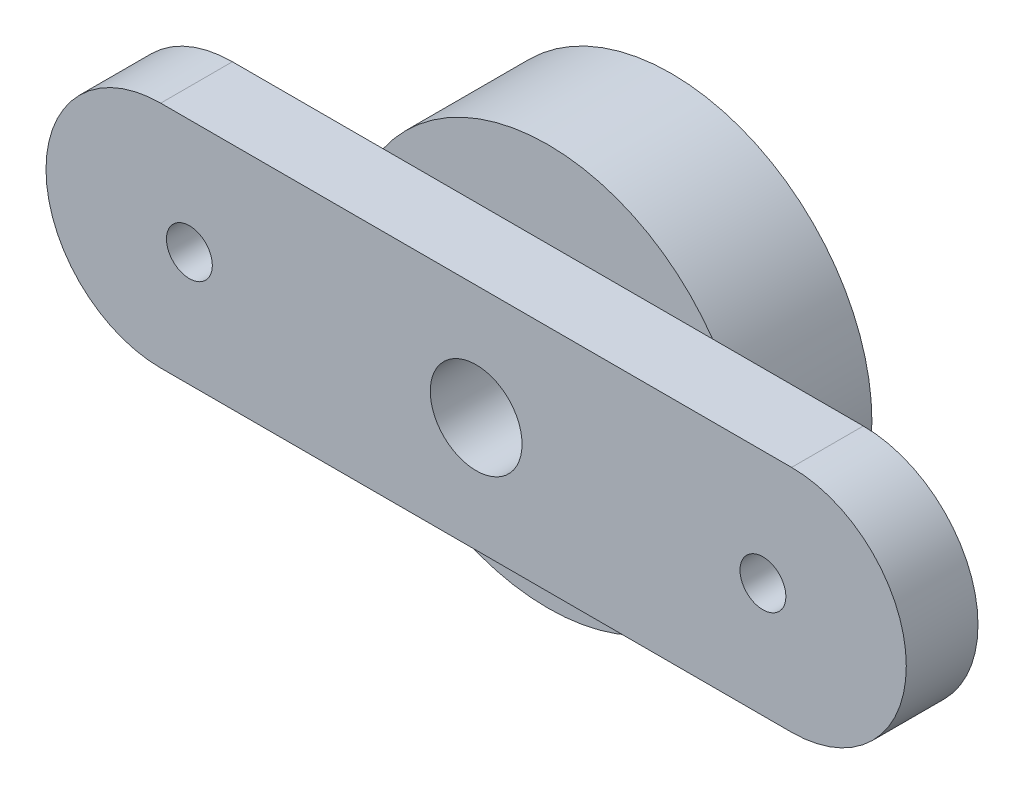
ISO-10303-21;
HEADER;
FILE_DESCRIPTION(('STEP AP214'),'2;1');
FILE_NAME('part.step','',(''),(''),'','','');
FILE_SCHEMA(('AUTOMOTIVE_DESIGN { 1 0 10303 214 1 1 1 1 }'));
ENDSEC;
DATA;
#1=APPLICATION_CONTEXT('core data for automotive mechanical design processes');
#2=APPLICATION_PROTOCOL_DEFINITION('international standard','automotive_design',2000,#1);
#3=PRODUCT_CONTEXT('',#1,'mechanical');
#4=PRODUCT('Part','Part','',(#3));
#5=PRODUCT_RELATED_PRODUCT_CATEGORY('part','',(#4));
#6=PRODUCT_DEFINITION_FORMATION('','',#4);
#7=PRODUCT_DEFINITION_CONTEXT('part definition',#1,'design');
#8=PRODUCT_DEFINITION('design','',#6,#7);
#9=PRODUCT_DEFINITION_SHAPE('','',#8);
#10=(LENGTH_UNIT() NAMED_UNIT(*) SI_UNIT(.MILLI.,.METRE.));
#11=(NAMED_UNIT(*) PLANE_ANGLE_UNIT() SI_UNIT($,.RADIAN.));
#12=(NAMED_UNIT(*) SI_UNIT($,.STERADIAN.) SOLID_ANGLE_UNIT());
#13=UNCERTAINTY_MEASURE_WITH_UNIT(LENGTH_MEASURE(1.E-05),#10,'distance_accuracy_value','');
#14=(GEOMETRIC_REPRESENTATION_CONTEXT(3) GLOBAL_UNCERTAINTY_ASSIGNED_CONTEXT((#13)) GLOBAL_UNIT_ASSIGNED_CONTEXT((#10,
#11,#12)) REPRESENTATION_CONTEXT('',''));
#15=CARTESIAN_POINT('',(0.,0.,0.));
#16=DIRECTION('',(0.,0.,1.));
#17=DIRECTION('',(1.,0.,0.));
#18=AXIS2_PLACEMENT_3D('',#15,#16,#17);
#19=CARTESIAN_POINT('',(0.,0.,6.5));
#20=DIRECTION('',(0.,0.,1.));
#21=DIRECTION('',(1.,0.,0.));
#22=AXIS2_PLACEMENT_3D('',#19,#20,#21);
#23=PLANE('',#22);
#24=DIRECTION('',(-1.,0.,0.));
#25=VECTOR('',#24,1.);
#26=CARTESIAN_POINT('',(-11.,4.,6.5));
#27=LINE('',#26,#25);
#28=CARTESIAN_POINT('',(5.74456264653803,4.,6.5));
#29=VERTEX_POINT('',#28);
#30=CARTESIAN_POINT('',(-5.74456264653803,4.,6.5));
#31=VERTEX_POINT('',#30);
#32=EDGE_CURVE('E11',#29,#31,#27,.T.);
#33=ORIENTED_EDGE('',*,*,#32,.F.);
#34=CARTESIAN_POINT('',(0.,0.,6.5));
#35=DIRECTION('',(0.,0.,1.));
#36=DIRECTION('',(1.,0.,0.));
#37=AXIS2_PLACEMENT_3D('',#34,#35,#36);
#38=CIRCLE('',#37,7.);
#39=EDGE_CURVE('E135',#29,#31,#38,.T.);
#40=ORIENTED_EDGE('',*,*,#39,.T.);
#41=EDGE_LOOP('',(#33,#40));
#42=FACE_BOUND('',#41,.T.);
#43=ADVANCED_FACE('F39',(#42),#23,.T.);
#44=DIRECTION('',(1.,0.,0.));
#45=VECTOR('',#44,1.);
#46=CARTESIAN_POINT('',(11.,-4.,6.5));
#47=LINE('',#46,#45);
#48=CARTESIAN_POINT('',(-5.74456264653803,-4.,6.5));
#49=VERTEX_POINT('',#48);
#50=CARTESIAN_POINT('',(5.74456264653803,-4.,6.5));
#51=VERTEX_POINT('',#50);
#52=EDGE_CURVE('E48',#49,#51,#47,.T.);
#53=ORIENTED_EDGE('',*,*,#52,.F.);
#54=EDGE_CURVE('E137',#49,#51,#38,.T.);
#55=ORIENTED_EDGE('',*,*,#54,.T.);
#56=EDGE_LOOP('',(#53,#55));
#57=FACE_BOUND('',#56,.T.);
#58=ADVANCED_FACE('F151',(#57),#23,.T.);
#59=CARTESIAN_POINT('',(0.,0.,2.2));
#60=DIRECTION('',(0.,0.,1.));
#61=DIRECTION('',(1.,0.,0.));
#62=AXIS2_PLACEMENT_3D('',#59,#60,#61);
#63=PLANE('',#62);
#64=CARTESIAN_POINT('',(0.,0.,2.2));
#65=DIRECTION('',(0.,0.,1.));
#66=DIRECTION('',(1.,0.,0.));
#67=AXIS2_PLACEMENT_3D('',#64,#65,#66);
#68=CIRCLE('',#67,7.);
#69=CARTESIAN_POINT('',(7.,0.,2.2));
#70=VERTEX_POINT('',#69);
#71=EDGE_CURVE('E43',#70,#70,#68,.T.);
#72=ORIENTED_EDGE('',*,*,#71,.F.);
#73=EDGE_LOOP('',(#72));
#74=FACE_BOUND('',#73,.T.);
#75=CARTESIAN_POINT('',(0.,0.,2.2));
#76=DIRECTION('',(0.,0.,1.));
#77=DIRECTION('',(1.,0.,0.));
#78=AXIS2_PLACEMENT_3D('',#75,#76,#77);
#79=CIRCLE('',#78,3.05);
#80=CARTESIAN_POINT('',(-3.05,0.,2.2));
#81=VERTEX_POINT('',#80);
#82=EDGE_CURVE('E124',#81,#81,#79,.T.);
#83=ORIENTED_EDGE('',*,*,#82,.T.);
#84=EDGE_LOOP('',(#83));
#85=FACE_BOUND('',#84,.T.);
#86=ADVANCED_FACE('F148',(#74,#85),#63,.F.);
#87=CARTESIAN_POINT('',(0.,0.,6.5));
#88=DIRECTION('',(0.,0.,-1.));
#89=DIRECTION('',(-1.,0.,0.));
#90=AXIS2_PLACEMENT_3D('',#87,#88,#89);
#91=CYLINDRICAL_SURFACE('',#90,7.);
#92=ORIENTED_EDGE('',*,*,#39,.F.);
#93=EDGE_CURVE('E133',#51,#29,#38,.T.);
#94=ORIENTED_EDGE('',*,*,#93,.F.);
#95=ORIENTED_EDGE('',*,*,#54,.F.);
#96=EDGE_CURVE('E61',#31,#49,#38,.T.);
#97=ORIENTED_EDGE('',*,*,#96,.F.);
#98=EDGE_LOOP('',(#92,#94,#95,#97));
#99=FACE_BOUND('',#98,.T.);
#100=ORIENTED_EDGE('',*,*,#71,.T.);
#101=EDGE_LOOP('',(#100));
#102=FACE_BOUND('',#101,.T.);
#103=ADVANCED_FACE('F41',(#99,#102),#91,.T.);
#104=CARTESIAN_POINT('',(0.,0.,6.5));
#105=DIRECTION('',(0.,0.,-1.));
#106=DIRECTION('',(-1.,0.,0.));
#107=AXIS2_PLACEMENT_3D('',#104,#105,#106);
#108=CYLINDRICAL_SURFACE('',#107,3.05);
#109=CARTESIAN_POINT('',(0.,0.,6.5));
#110=DIRECTION('',(0.,0.,1.));
#111=DIRECTION('',(1.,0.,0.));
#112=AXIS2_PLACEMENT_3D('',#109,#110,#111);
#113=CIRCLE('',#112,3.05);
#114=CARTESIAN_POINT('',(-3.05,0.,6.5));
#115=VERTEX_POINT('',#114);
#116=EDGE_CURVE('E122',#115,#115,#113,.T.);
#117=CARTESIAN_POINT('',(-3.05,0.,6.5));
#118=CARTESIAN_POINT('',(-3.05,0.,6.45520833333333));
#119=CARTESIAN_POINT('',(-3.05,0.,6.41041666666667));
#120=CARTESIAN_POINT('',(-3.05,0.,6.32083333333333));
#121=CARTESIAN_POINT('',(-3.05,0.,6.27604166666667));
#122=CARTESIAN_POINT('',(-3.05,0.,6.18645833333333));
#123=CARTESIAN_POINT('',(-3.05,0.,6.14166666666667));
#124=CARTESIAN_POINT('',(-3.05,0.,6.05208333333333));
#125=CARTESIAN_POINT('',(-3.05,0.,6.00729166666667));
#126=CARTESIAN_POINT('',(-3.05,0.,5.91770833333333));
#127=CARTESIAN_POINT('',(-3.05,0.,5.87291666666667));
#128=CARTESIAN_POINT('',(-3.05,0.,5.78333333333333));
#129=CARTESIAN_POINT('',(-3.05,0.,5.73854166666667));
#130=CARTESIAN_POINT('',(-3.05,0.,5.64895833333333));
#131=CARTESIAN_POINT('',(-3.05,0.,5.60416666666667));
#132=CARTESIAN_POINT('',(-3.05,0.,5.51458333333333));
#133=CARTESIAN_POINT('',(-3.05,0.,5.46979166666667));
#134=CARTESIAN_POINT('',(-3.05,0.,5.38020833333333));
#135=CARTESIAN_POINT('',(-3.05,0.,5.33541666666667));
#136=CARTESIAN_POINT('',(-3.05,0.,5.24583333333333));
#137=CARTESIAN_POINT('',(-3.05,0.,5.20104166666667));
#138=CARTESIAN_POINT('',(-3.05,0.,5.11145833333333));
#139=CARTESIAN_POINT('',(-3.05,0.,5.06666666666667));
#140=CARTESIAN_POINT('',(-3.05,0.,4.97708333333333));
#141=CARTESIAN_POINT('',(-3.05,0.,4.93229166666667));
#142=CARTESIAN_POINT('',(-3.05,0.,4.84270833333333));
#143=CARTESIAN_POINT('',(-3.05,0.,4.79791666666667));
#144=CARTESIAN_POINT('',(-3.05,0.,4.70833333333333));
#145=CARTESIAN_POINT('',(-3.05,0.,4.66354166666667));
#146=CARTESIAN_POINT('',(-3.05,0.,4.57395833333333));
#147=CARTESIAN_POINT('',(-3.05,0.,4.52916666666667));
#148=CARTESIAN_POINT('',(-3.05,0.,4.43958333333333));
#149=CARTESIAN_POINT('',(-3.05,0.,4.39479166666667));
#150=CARTESIAN_POINT('',(-3.05,0.,4.30520833333333));
#151=CARTESIAN_POINT('',(-3.05,0.,4.26041666666667));
#152=CARTESIAN_POINT('',(-3.05,0.,4.17083333333333));
#153=CARTESIAN_POINT('',(-3.05,0.,4.12604166666667));
#154=CARTESIAN_POINT('',(-3.05,0.,4.03645833333333));
#155=CARTESIAN_POINT('',(-3.05,0.,3.99166666666667));
#156=CARTESIAN_POINT('',(-3.05,0.,3.90208333333333));
#157=CARTESIAN_POINT('',(-3.05,0.,3.85729166666667));
#158=CARTESIAN_POINT('',(-3.05,0.,3.76770833333333));
#159=CARTESIAN_POINT('',(-3.05,0.,3.72291666666667));
#160=CARTESIAN_POINT('',(-3.05,0.,3.63333333333333));
#161=CARTESIAN_POINT('',(-3.05,0.,3.58854166666667));
#162=CARTESIAN_POINT('',(-3.05,0.,3.49895833333333));
#163=CARTESIAN_POINT('',(-3.05,0.,3.45416666666667));
#164=CARTESIAN_POINT('',(-3.05,0.,3.36458333333333));
#165=CARTESIAN_POINT('',(-3.05,0.,3.31979166666667));
#166=CARTESIAN_POINT('',(-3.05,0.,3.23020833333333));
#167=CARTESIAN_POINT('',(-3.05,0.,3.18541666666667));
#168=CARTESIAN_POINT('',(-3.05,0.,3.09583333333333));
#169=CARTESIAN_POINT('',(-3.05,0.,3.05104166666667));
#170=CARTESIAN_POINT('',(-3.05,0.,2.96145833333333));
#171=CARTESIAN_POINT('',(-3.05,0.,2.91666666666667));
#172=CARTESIAN_POINT('',(-3.05,0.,2.82708333333333));
#173=CARTESIAN_POINT('',(-3.05,0.,2.78229166666667));
#174=CARTESIAN_POINT('',(-3.05,0.,2.69270833333333));
#175=CARTESIAN_POINT('',(-3.05,0.,2.64791666666667));
#176=CARTESIAN_POINT('',(-3.05,0.,2.55833333333333));
#177=CARTESIAN_POINT('',(-3.05,0.,2.51354166666667));
#178=CARTESIAN_POINT('',(-3.05,0.,2.42395833333333));
#179=CARTESIAN_POINT('',(-3.05,0.,2.37916666666667));
#180=CARTESIAN_POINT('',(-3.05,0.,2.28958333333333));
#181=CARTESIAN_POINT('',(-3.05,0.,2.24479166666667));
#182=CARTESIAN_POINT('',(-3.05,0.,2.2));
#183=B_SPLINE_CURVE_WITH_KNOTS('',3,(#117,#118,#119,#120,#121,#122,#123,#124,#125,#126,#127,
#128,#129,#130,#131,#132,#133,#134,#135,#136,#137,#138,#139,#140,#141,#142,#143,#144,#145,#146,
#147,#148,#149,#150,#151,#152,#153,#154,#155,#156,#157,#158,#159,#160,#161,#162,#163,#164,#165,
#166,#167,#168,#169,#170,#171,#172,#173,#174,#175,#176,#177,#178,#179,#180,#181,#182),
.UNSPECIFIED.,.F.,.F.,(4,2,2,2,2,2,2,2,2,2,2,2,2,2,2,2,2,2,2,2,2,2,2,2,2,2,2,2,2,2,2,2,4),(0.,
0.134375000000001,0.268750000000001,0.403125000000001,0.537500000000001,0.671875000000001,
0.806250000000001,0.940625,1.075,1.209375,1.34375,1.478125,1.6125,1.746875,1.88125,2.015625,
2.15,2.284375,2.41875,2.553125,2.6875,2.821875,2.95625,3.090625,3.225,3.359375,3.49375,3.628125,
3.7625,3.896875,4.03125,4.165625,4.3),.UNSPECIFIED.);
#184=EDGE_CURVE('BSEAM157',#115,#81,#183,.T.);
#185=ORIENTED_EDGE('',*,*,#116,.T.);
#186=ORIENTED_EDGE('',*,*,#82,.F.);
#187=ORIENTED_EDGE('',*,*,#184,.T.);
#188=ORIENTED_EDGE('',*,*,#184,.F.);
#189=EDGE_LOOP('',(#185,#187,#186,#188));
#190=FACE_BOUND('',#189,.T.);
#191=ADVANCED_FACE('F157',(#190),#108,.F.);
#192=CARTESIAN_POINT('',(-11.,0.,6.5));
#193=DIRECTION('',(0.,0.,-1.));
#194=DIRECTION('',(-1.,0.,0.));
#195=AXIS2_PLACEMENT_3D('',#192,#193,#194);
#196=PLANE('',#195);
#197=CARTESIAN_POINT('',(-10.,0.,6.5));
#198=DIRECTION('',(0.,0.,1.));
#199=DIRECTION('',(1.,0.,0.));
#200=AXIS2_PLACEMENT_3D('',#197,#198,#199);
#201=CIRCLE('',#200,0.8);
#202=CARTESIAN_POINT('',(-9.2,0.,6.5));
#203=VERTEX_POINT('',#202);
#204=EDGE_CURVE('E197',#203,#203,#201,.T.);
#205=ORIENTED_EDGE('',*,*,#204,.T.);
#206=EDGE_LOOP('',(#205));
#207=FACE_BOUND('',#206,.T.);
#208=CARTESIAN_POINT('',(-11.,4.,6.5));
#209=VERTEX_POINT('',#208);
#210=EDGE_CURVE('E51',#31,#209,#27,.T.);
#211=ORIENTED_EDGE('',*,*,#210,.F.);
#212=ORIENTED_EDGE('',*,*,#96,.T.);
#213=CARTESIAN_POINT('',(-11.,-4.,6.5));
#214=VERTEX_POINT('',#213);
#215=EDGE_CURVE('E140',#214,#49,#47,.T.);
#216=ORIENTED_EDGE('',*,*,#215,.F.);
#217=CARTESIAN_POINT('',(-11.,0.,6.5));
#218=DIRECTION('',(0.,0.,1.));
#219=DIRECTION('',(-1.,0.,0.));
#220=AXIS2_PLACEMENT_3D('',#217,#218,#219);
#221=CIRCLE('',#220,4.);
#222=EDGE_CURVE('E123',#209,#214,#221,.T.);
#223=ORIENTED_EDGE('',*,*,#222,.F.);
#224=EDGE_LOOP('',(#211,#212,#216,#223));
#225=FACE_BOUND('',#224,.T.);
#226=ADVANCED_FACE('F156',(#207,#225),#196,.T.);
#227=CARTESIAN_POINT('',(0.,0.,6.5));
#228=DIRECTION('',(0.,0.,1.));
#229=DIRECTION('',(1.,0.,0.));
#230=AXIS2_PLACEMENT_3D('',#227,#228,#229);
#231=CIRCLE('',#230,1.6);
#232=CARTESIAN_POINT('',(1.6,0.,6.5));
#233=VERTEX_POINT('',#232);
#234=EDGE_CURVE('E195',#233,#233,#231,.T.);
#235=ORIENTED_EDGE('',*,*,#234,.T.);
#236=EDGE_LOOP('',(#235));
#237=FACE_BOUND('',#236,.T.);
#238=ORIENTED_EDGE('',*,*,#116,.F.);
#239=EDGE_LOOP('',(#238));
#240=FACE_BOUND('',#239,.T.);
#241=ADVANCED_FACE('F164',(#237,#240),#196,.T.);
#242=CARTESIAN_POINT('',(-11.,0.,9.));
#243=DIRECTION('',(0.,0.,-1.));
#244=DIRECTION('',(-1.,0.,0.));
#245=AXIS2_PLACEMENT_3D('',#242,#243,#244);
#246=PLANE('',#245);
#247=CARTESIAN_POINT('',(-11.,0.,9.));
#248=DIRECTION('',(0.,0.,1.));
#249=DIRECTION('',(-1.,0.,0.));
#250=AXIS2_PLACEMENT_3D('',#247,#248,#249);
#251=CIRCLE('',#250,4.);
#252=CARTESIAN_POINT('',(-11.,4.,9.));
#253=VERTEX_POINT('',#252);
#254=CARTESIAN_POINT('',(-11.,-4.,9.));
#255=VERTEX_POINT('',#254);
#256=EDGE_CURVE('E106',#253,#255,#251,.T.);
#257=ORIENTED_EDGE('',*,*,#256,.T.);
#258=DIRECTION('',(1.,0.,0.));
#259=VECTOR('',#258,1.);
#260=CARTESIAN_POINT('',(11.,-4.,9.));
#261=LINE('',#260,#259);
#262=CARTESIAN_POINT('',(11.,-4.,9.));
#263=VERTEX_POINT('',#262);
#264=EDGE_CURVE('E96',#255,#263,#261,.T.);
#265=ORIENTED_EDGE('',*,*,#264,.T.);
#266=CARTESIAN_POINT('',(11.,0.,9.));
#267=DIRECTION('',(0.,0.,1.));
#268=DIRECTION('',(-1.,0.,0.));
#269=AXIS2_PLACEMENT_3D('',#266,#267,#268);
#270=CIRCLE('',#269,4.);
#271=CARTESIAN_POINT('',(11.,4.,9.));
#272=VERTEX_POINT('',#271);
#273=EDGE_CURVE('E110',#263,#272,#270,.T.);
#274=ORIENTED_EDGE('',*,*,#273,.T.);
#275=DIRECTION('',(-1.,0.,0.));
#276=VECTOR('',#275,1.);
#277=CARTESIAN_POINT('',(-11.,4.,9.));
#278=LINE('',#277,#276);
#279=EDGE_CURVE('E114',#272,#253,#278,.T.);
#280=ORIENTED_EDGE('',*,*,#279,.T.);
#281=EDGE_LOOP('',(#257,#265,#274,#280));
#282=FACE_BOUND('',#281,.T.);
#283=CARTESIAN_POINT('',(0.,0.,9.));
#284=DIRECTION('',(0.,0.,1.));
#285=DIRECTION('',(1.,0.,0.));
#286=AXIS2_PLACEMENT_3D('',#283,#284,#285);
#287=CIRCLE('',#286,1.6);
#288=CARTESIAN_POINT('',(1.6,0.,9.));
#289=VERTEX_POINT('',#288);
#290=EDGE_CURVE('E193',#289,#289,#287,.T.);
#291=ORIENTED_EDGE('',*,*,#290,.F.);
#292=EDGE_LOOP('',(#291));
#293=FACE_BOUND('',#292,.T.);
#294=CARTESIAN_POINT('',(-10.,0.,9.));
#295=DIRECTION('',(0.,0.,1.));
#296=DIRECTION('',(1.,0.,0.));
#297=AXIS2_PLACEMENT_3D('',#294,#295,#296);
#298=CIRCLE('',#297,0.8);
#299=CARTESIAN_POINT('',(-9.2,0.,9.));
#300=VERTEX_POINT('',#299);
#301=EDGE_CURVE('E198',#300,#300,#298,.T.);
#302=ORIENTED_EDGE('',*,*,#301,.F.);
#303=EDGE_LOOP('',(#302));
#304=FACE_BOUND('',#303,.T.);
#305=CARTESIAN_POINT('',(10.,0.,9.));
#306=DIRECTION('',(0.,0.,1.));
#307=DIRECTION('',(1.,0.,0.));
#308=AXIS2_PLACEMENT_3D('',#305,#306,#307);
#309=CIRCLE('',#308,0.8);
#310=CARTESIAN_POINT('',(10.8,0.,9.));
#311=VERTEX_POINT('',#310);
#312=EDGE_CURVE('E205',#311,#311,#309,.T.);
#313=ORIENTED_EDGE('',*,*,#312,.F.);
#314=EDGE_LOOP('',(#313));
#315=FACE_BOUND('',#314,.T.);
#316=ADVANCED_FACE('F112',(#282,#293,#304,#315),#246,.F.);
#317=CARTESIAN_POINT('',(11.,-4.,6.5));
#318=VERTEX_POINT('',#317);
#319=EDGE_CURVE('E138',#51,#318,#47,.T.);
#320=ORIENTED_EDGE('',*,*,#319,.F.);
#321=ORIENTED_EDGE('',*,*,#93,.T.);
#322=CARTESIAN_POINT('',(11.,4.,6.5));
#323=VERTEX_POINT('',#322);
#324=EDGE_CURVE('E49',#323,#29,#27,.T.);
#325=ORIENTED_EDGE('',*,*,#324,.F.);
#326=CARTESIAN_POINT('',(11.,0.,6.5));
#327=DIRECTION('',(0.,0.,1.));
#328=DIRECTION('',(-1.,0.,0.));
#329=AXIS2_PLACEMENT_3D('',#326,#327,#328);
#330=CIRCLE('',#329,4.);
#331=EDGE_CURVE('E178',#318,#323,#330,.T.);
#332=ORIENTED_EDGE('',*,*,#331,.F.);
#333=EDGE_LOOP('',(#320,#321,#325,#332));
#334=FACE_BOUND('',#333,.T.);
#335=CARTESIAN_POINT('',(10.,0.,6.5));
#336=DIRECTION('',(0.,0.,1.));
#337=DIRECTION('',(1.,0.,0.));
#338=AXIS2_PLACEMENT_3D('',#335,#336,#337);
#339=CIRCLE('',#338,0.8);
#340=CARTESIAN_POINT('',(10.8,0.,6.5));
#341=VERTEX_POINT('',#340);
#342=EDGE_CURVE('E203',#341,#341,#339,.T.);
#343=ORIENTED_EDGE('',*,*,#342,.T.);
#344=EDGE_LOOP('',(#343));
#345=FACE_BOUND('',#344,.T.);
#346=ADVANCED_FACE('F166',(#334,#345),#196,.T.);
#347=CARTESIAN_POINT('',(-11.,0.,9.));
#348=DIRECTION('',(0.,0.,-1.));
#349=DIRECTION('',(-1.,0.,0.));
#350=AXIS2_PLACEMENT_3D('',#347,#348,#349);
#351=CYLINDRICAL_SURFACE('',#350,4.);
#352=ORIENTED_EDGE('',*,*,#222,.T.);
#353=DIRECTION('',(0.,0.,-1.));
#354=VECTOR('',#353,1.);
#355=CARTESIAN_POINT('',(-11.,-4.,9.));
#356=LINE('',#355,#354);
#357=EDGE_CURVE('E102',#255,#214,#356,.T.);
#358=ORIENTED_EDGE('',*,*,#357,.F.);
#359=ORIENTED_EDGE('',*,*,#256,.F.);
#360=DIRECTION('',(0.,0.,-1.));
#361=VECTOR('',#360,1.);
#362=CARTESIAN_POINT('',(-11.,4.,9.));
#363=LINE('',#362,#361);
#364=EDGE_CURVE('E182',#253,#209,#363,.T.);
#365=ORIENTED_EDGE('',*,*,#364,.T.);
#366=EDGE_LOOP('',(#352,#358,#359,#365));
#367=FACE_BOUND('',#366,.T.);
#368=ADVANCED_FACE('F117',(#367),#351,.T.);
#369=CARTESIAN_POINT('',(11.,-4.,9.));
#370=DIRECTION('',(0.,1.,0.));
#371=DIRECTION('',(0.,0.,1.));
#372=AXIS2_PLACEMENT_3D('',#369,#370,#371);
#373=PLANE('',#372);
#374=ORIENTED_EDGE('',*,*,#215,.T.);
#375=ORIENTED_EDGE('',*,*,#52,.T.);
#376=ORIENTED_EDGE('',*,*,#319,.T.);
#377=DIRECTION('',(0.,0.,-1.));
#378=VECTOR('',#377,1.);
#379=CARTESIAN_POINT('',(11.,-4.,9.));
#380=LINE('',#379,#378);
#381=EDGE_CURVE('E101',#263,#318,#380,.T.);
#382=ORIENTED_EDGE('',*,*,#381,.F.);
#383=ORIENTED_EDGE('',*,*,#264,.F.);
#384=ORIENTED_EDGE('',*,*,#357,.T.);
#385=EDGE_LOOP('',(#374,#375,#376,#382,#383,#384));
#386=FACE_BOUND('',#385,.T.);
#387=ADVANCED_FACE('F98',(#386),#373,.F.);
#388=CARTESIAN_POINT('',(11.,0.,9.));
#389=DIRECTION('',(0.,0.,-1.));
#390=DIRECTION('',(-1.,0.,0.));
#391=AXIS2_PLACEMENT_3D('',#388,#389,#390);
#392=CYLINDRICAL_SURFACE('',#391,4.);
#393=ORIENTED_EDGE('',*,*,#331,.T.);
#394=DIRECTION('',(0.,0.,-1.));
#395=VECTOR('',#394,1.);
#396=CARTESIAN_POINT('',(11.,4.,9.));
#397=LINE('',#396,#395);
#398=EDGE_CURVE('E130',#272,#323,#397,.T.);
#399=ORIENTED_EDGE('',*,*,#398,.F.);
#400=ORIENTED_EDGE('',*,*,#273,.F.);
#401=ORIENTED_EDGE('',*,*,#381,.T.);
#402=EDGE_LOOP('',(#393,#399,#400,#401));
#403=FACE_BOUND('',#402,.T.);
#404=ADVANCED_FACE('F188',(#403),#392,.T.);
#405=CARTESIAN_POINT('',(-11.,4.,9.));
#406=DIRECTION('',(0.,-1.,0.));
#407=DIRECTION('',(0.,0.,-1.));
#408=AXIS2_PLACEMENT_3D('',#405,#406,#407);
#409=PLANE('',#408);
#410=ORIENTED_EDGE('',*,*,#324,.T.);
#411=ORIENTED_EDGE('',*,*,#32,.T.);
#412=ORIENTED_EDGE('',*,*,#210,.T.);
#413=ORIENTED_EDGE('',*,*,#364,.F.);
#414=ORIENTED_EDGE('',*,*,#279,.F.);
#415=ORIENTED_EDGE('',*,*,#398,.T.);
#416=EDGE_LOOP('',(#410,#411,#412,#413,#414,#415));
#417=FACE_BOUND('',#416,.T.);
#418=ADVANCED_FACE('F190',(#417),#409,.F.);
#419=CARTESIAN_POINT('',(0.,0.,9.));
#420=DIRECTION('',(0.,0.,-1.));
#421=DIRECTION('',(-1.,0.,0.));
#422=AXIS2_PLACEMENT_3D('',#419,#420,#421);
#423=CYLINDRICAL_SURFACE('',#422,1.6);
#424=ORIENTED_EDGE('',*,*,#290,.T.);
#425=EDGE_LOOP('',(#424));
#426=FACE_BOUND('',#425,.T.);
#427=ORIENTED_EDGE('',*,*,#234,.F.);
#428=EDGE_LOOP('',(#427));
#429=FACE_BOUND('',#428,.T.);
#430=ADVANCED_FACE('F225',(#426,#429),#423,.F.);
#431=CARTESIAN_POINT('',(-10.,0.,9.));
#432=DIRECTION('',(0.,0.,-1.));
#433=DIRECTION('',(-1.,0.,0.));
#434=AXIS2_PLACEMENT_3D('',#431,#432,#433);
#435=CYLINDRICAL_SURFACE('',#434,0.8);
#436=ORIENTED_EDGE('',*,*,#301,.T.);
#437=EDGE_LOOP('',(#436));
#438=FACE_BOUND('',#437,.T.);
#439=ORIENTED_EDGE('',*,*,#204,.F.);
#440=EDGE_LOOP('',(#439));
#441=FACE_BOUND('',#440,.T.);
#442=ADVANCED_FACE('F257',(#438,#441),#435,.F.);
#443=CARTESIAN_POINT('',(10.,0.,9.));
#444=DIRECTION('',(0.,0.,-1.));
#445=DIRECTION('',(-1.,0.,0.));
#446=AXIS2_PLACEMENT_3D('',#443,#444,#445);
#447=CYLINDRICAL_SURFACE('',#446,0.8);
#448=ORIENTED_EDGE('',*,*,#312,.T.);
#449=EDGE_LOOP('',(#448));
#450=FACE_BOUND('',#449,.T.);
#451=ORIENTED_EDGE('',*,*,#342,.F.);
#452=EDGE_LOOP('',(#451));
#453=FACE_BOUND('',#452,.T.);
#454=ADVANCED_FACE('F213',(#450,#453),#447,.F.);
#455=CLOSED_SHELL('',(#43,#58,#86,#103,#191,#226,#241,#316,#346,#368,#387,#404,#418,#430,#442,#454));
#456=MANIFOLD_SOLID_BREP('B2',#455);
#457=ADVANCED_BREP_SHAPE_REPRESENTATION('',(#18,#456),#14);
#458=SHAPE_DEFINITION_REPRESENTATION(#9,#457);
ENDSEC;
END-ISO-10303-21;
